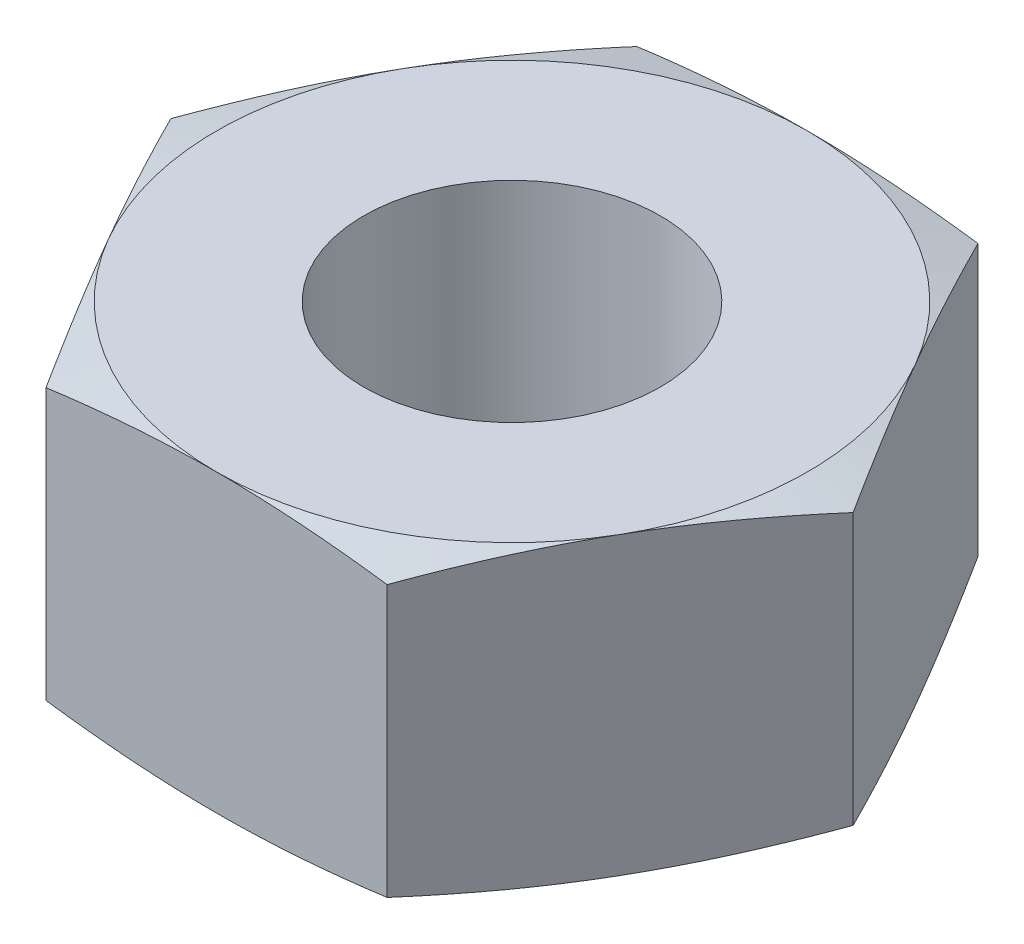
ISO-10303-21;
HEADER;
FILE_DESCRIPTION(('STEP AP214'),'2;1');
FILE_NAME('part.step','',(''),(''),'','','');
FILE_SCHEMA(('AUTOMOTIVE_DESIGN { 1 0 10303 214 1 1 1 1 }'));
ENDSEC;
DATA;
#1=APPLICATION_CONTEXT('core data for automotive mechanical design processes');
#2=APPLICATION_PROTOCOL_DEFINITION('international standard','automotive_design',2000,#1);
#3=PRODUCT_CONTEXT('',#1,'mechanical');
#4=PRODUCT('Part','Part','',(#3));
#5=PRODUCT_RELATED_PRODUCT_CATEGORY('part','',(#4));
#6=PRODUCT_DEFINITION_FORMATION('','',#4);
#7=PRODUCT_DEFINITION_CONTEXT('part definition',#1,'design');
#8=PRODUCT_DEFINITION('design','',#6,#7);
#9=PRODUCT_DEFINITION_SHAPE('','',#8);
#10=(LENGTH_UNIT() NAMED_UNIT(*) SI_UNIT(.MILLI.,.METRE.));
#11=(NAMED_UNIT(*) PLANE_ANGLE_UNIT() SI_UNIT($,.RADIAN.));
#12=(NAMED_UNIT(*) SI_UNIT($,.STERADIAN.) SOLID_ANGLE_UNIT());
#13=UNCERTAINTY_MEASURE_WITH_UNIT(LENGTH_MEASURE(1.E-05),#10,'distance_accuracy_value','');
#14=(GEOMETRIC_REPRESENTATION_CONTEXT(3) GLOBAL_UNCERTAINTY_ASSIGNED_CONTEXT((#13)) GLOBAL_UNIT_ASSIGNED_CONTEXT((#10,
#11,#12)) REPRESENTATION_CONTEXT('',''));
#15=CARTESIAN_POINT('',(0.,0.,0.));
#16=DIRECTION('',(0.,0.,1.));
#17=DIRECTION('',(1.,0.,0.));
#18=AXIS2_PLACEMENT_3D('',#15,#16,#17);
#19=CARTESIAN_POINT('',(2.3094010767585,2.,4.));
#20=DIRECTION('',(-0.866025403784439,0.,-0.5));
#21=DIRECTION('',(-0.5,0.,0.866025403784439));
#22=AXIS2_PLACEMENT_3D('',#19,#20,#21);
#23=PLANE('',#22);
#24=CARTESIAN_POINT('',(4.61891762357084,-1.83416152142258,-0.00020000000000131));
#25=CARTESIAN_POINT('',(4.52300443742428,-1.85987303025889,0.165926511521661));
#26=CARTESIAN_POINT('',(4.42691734174285,-1.88321489853113,0.332354243193626));
#27=CARTESIAN_POINT('',(4.23440378825448,-1.9242244457158,0.665797498981119));
#28=CARTESIAN_POINT('',(4.13797720861907,-1.94188981954163,0.832813234109736));
#29=CARTESIAN_POINT('',(3.94536936350192,-1.97051501923541,1.16641980778899));
#30=CARTESIAN_POINT('',(3.84918940062809,-1.98150898419453,1.33300839015655));
#31=CARTESIAN_POINT('',(3.65670681198446,-1.99625077349232,1.66639801325971));
#32=CARTESIAN_POINT('',(3.5604042135611,-1.99999999999999,1.83319900662985));
#33=CARTESIAN_POINT('',(3.3677990167144,-1.99999999999999,2.16680099337015));
#34=CARTESIAN_POINT('',(3.27149641829105,-1.99625077349232,2.33360198674029));
#35=CARTESIAN_POINT('',(3.07901382964742,-1.98150898419453,2.66699160984345));
#36=CARTESIAN_POINT('',(2.98283386677359,-1.97051501923541,2.83358019221101));
#37=CARTESIAN_POINT('',(2.79022602165644,-1.94188981954163,3.16718676589026));
#38=CARTESIAN_POINT('',(2.69379944202103,-1.9242244457158,3.33420250101888));
#39=CARTESIAN_POINT('',(2.50128588853266,-1.88321489853113,3.66764575680637));
#40=CARTESIAN_POINT('',(2.40519879285123,-1.85987303025888,3.83407348847834));
#41=CARTESIAN_POINT('',(2.30928560670466,-1.83416152142257,4.0002));
#42=B_SPLINE_CURVE_WITH_KNOTS('',3,(#24,#25,#26,#27,#28,#29,#30,#31,#32,#33,#34,#35,#36,#37,#38,
#39,#40,#41),.UNSPECIFIED.,.F.,.F.,(4,2,2,2,2,2,2,2,4),(0.,0.580655908162846,1.1615473094924,
1.73944052622642,2.31722188451988,2.89500324281333,3.47289645954735,4.05378786087691,
4.63444376903975),.UNSPECIFIED.);
#43=CARTESIAN_POINT('',(4.61880215351701,-1.83419246269047,0.));
#44=VERTEX_POINT('',#43);
#45=CARTESIAN_POINT('',(3.46410161513776,-2.,2.));
#46=VERTEX_POINT('',#45);
#47=EDGE_CURVE('E54',#44,#46,#42,.T.);
#48=ORIENTED_EDGE('',*,*,#47,.F.);
#49=DIRECTION('',(0.,-1.,0.));
#50=VECTOR('',#49,1.);
#51=CARTESIAN_POINT('',(4.61880215351701,2.,0.));
#52=LINE('',#51,#50);
#53=CARTESIAN_POINT('',(4.618802153517,1.83419246269047,0.));
#54=VERTEX_POINT('',#53);
#55=EDGE_CURVE('E171',#54,#44,#52,.T.);
#56=ORIENTED_EDGE('',*,*,#55,.F.);
#57=CARTESIAN_POINT('',(2.30928560670466,1.83416152142257,4.0002));
#58=CARTESIAN_POINT('',(2.40519879285123,1.85987303025889,3.83407348847834));
#59=CARTESIAN_POINT('',(2.50128588853266,1.88321489853113,3.66764575680637));
#60=CARTESIAN_POINT('',(2.69379944202103,1.9242244457158,3.33420250101888));
#61=CARTESIAN_POINT('',(2.79022602165644,1.94188981954163,3.16718676589026));
#62=CARTESIAN_POINT('',(2.98283386677359,1.97051501923541,2.83358019221101));
#63=CARTESIAN_POINT('',(3.07901382964742,1.98150898419453,2.66699160984345));
#64=CARTESIAN_POINT('',(3.27149641829105,1.99625077349232,2.33360198674029));
#65=CARTESIAN_POINT('',(3.3677990167144,1.99999999999999,2.16680099337015));
#66=CARTESIAN_POINT('',(3.5604042135611,1.99999999999999,1.83319900662985));
#67=CARTESIAN_POINT('',(3.65670681198446,1.99625077349232,1.66639801325971));
#68=CARTESIAN_POINT('',(3.84918940062809,1.98150898419453,1.33300839015655));
#69=CARTESIAN_POINT('',(3.94536936350192,1.97051501923541,1.16641980778899));
#70=CARTESIAN_POINT('',(4.13797720861907,1.94188981954163,0.832813234109736));
#71=CARTESIAN_POINT('',(4.23440378825448,1.9242244457158,0.665797498981119));
#72=CARTESIAN_POINT('',(4.42691734174285,1.88321489853113,0.332354243193626));
#73=CARTESIAN_POINT('',(4.52300443742428,1.85987303025889,0.165926511521661));
#74=CARTESIAN_POINT('',(4.61891762357084,1.83416152142257,-0.000200000000001436));
#75=B_SPLINE_CURVE_WITH_KNOTS('',3,(#57,#58,#59,#60,#61,#62,#63,#64,#65,#66,#67,#68,#69,#70,#71,
#72,#73,#74),.UNSPECIFIED.,.F.,.F.,(4,2,2,2,2,2,2,2,4),(0.,0.580655908162845,1.1615473094924,
1.73944052622642,2.31722188451988,2.89500324281333,3.47289645954735,4.05378786087691,
4.63444376903975),.UNSPECIFIED.);
#76=CARTESIAN_POINT('',(3.46410161513776,2.,2.));
#77=VERTEX_POINT('',#76);
#78=EDGE_CURVE('E260',#77,#54,#75,.T.);
#79=ORIENTED_EDGE('',*,*,#78,.F.);
#80=CARTESIAN_POINT('',(2.3094010767585,1.83419246269048,4.));
#81=VERTEX_POINT('',#80);
#82=EDGE_CURVE('E162',#81,#77,#75,.T.);
#83=ORIENTED_EDGE('',*,*,#82,.F.);
#84=DIRECTION('',(0.,-1.,0.));
#85=VECTOR('',#84,1.);
#86=CARTESIAN_POINT('',(2.3094010767585,2.,4.));
#87=LINE('',#86,#85);
#88=CARTESIAN_POINT('',(2.30940107675851,-1.83419246269048,4.));
#89=VERTEX_POINT('',#88);
#90=EDGE_CURVE('E157',#81,#89,#87,.T.);
#91=ORIENTED_EDGE('',*,*,#90,.T.);
#92=EDGE_CURVE('E149',#46,#89,#42,.T.);
#93=ORIENTED_EDGE('',*,*,#92,.F.);
#94=EDGE_LOOP('',(#48,#56,#79,#83,#91,#93));
#95=FACE_BOUND('',#94,.T.);
#96=ADVANCED_FACE('F38',(#95),#23,.F.);
#97=CARTESIAN_POINT('',(4.61880215351701,2.,0.));
#98=DIRECTION('',(-0.866025403784439,0.,0.5));
#99=DIRECTION('',(0.5,0.,0.866025403784439));
#100=AXIS2_PLACEMENT_3D('',#97,#98,#99);
#101=PLANE('',#100);
#102=CARTESIAN_POINT('',(2.30928560670467,-1.83416152142257,-4.0002));
#103=CARTESIAN_POINT('',(2.40519879285123,-1.85987303025889,-3.83407348847834));
#104=CARTESIAN_POINT('',(2.50128588853266,-1.88321489853113,-3.66764575680637));
#105=CARTESIAN_POINT('',(2.69379944202103,-1.9242244457158,-3.33420250101888));
#106=CARTESIAN_POINT('',(2.79022602165644,-1.94188981954163,-3.16718676589026));
#107=CARTESIAN_POINT('',(2.98283386677359,-1.97051501923541,-2.83358019221101));
#108=CARTESIAN_POINT('',(3.07901382964742,-1.98150898419453,-2.66699160984345));
#109=CARTESIAN_POINT('',(3.27149641829105,-1.99625077349232,-2.33360198674029));
#110=CARTESIAN_POINT('',(3.3677990167144,-1.99999999999999,-2.16680099337015));
#111=CARTESIAN_POINT('',(3.56040421356111,-1.99999999999999,-1.83319900662985));
#112=CARTESIAN_POINT('',(3.65670681198446,-1.99625077349232,-1.66639801325971));
#113=CARTESIAN_POINT('',(3.84918940062809,-1.98150898419454,-1.33300839015655));
#114=CARTESIAN_POINT('',(3.94536936350192,-1.97051501923541,-1.16641980778899));
#115=CARTESIAN_POINT('',(4.13797720861907,-1.94188981954163,-0.832813234109737));
#116=CARTESIAN_POINT('',(4.23440378825448,-1.9242244457158,-0.66579749898112));
#117=CARTESIAN_POINT('',(4.42691734174285,-1.88321489853113,-0.332354243193627));
#118=CARTESIAN_POINT('',(4.52300443742428,-1.85987303025888,-0.165926511521662));
#119=CARTESIAN_POINT('',(4.61891762357084,-1.83416152142257,0.000199999999999917));
#120=B_SPLINE_CURVE_WITH_KNOTS('',3,(#102,#103,#104,#105,#106,#107,#108,#109,#110,#111,#112,
#113,#114,#115,#116,#117,#118,#119),.UNSPECIFIED.,.F.,.F.,(4,2,2,2,2,2,2,2,4),(0.,
0.580655908162846,1.1615473094924,1.73944052622642,2.31722188451988,2.89500324281333,
3.47289645954735,4.05378786087691,4.63444376903975),.UNSPECIFIED.);
#121=CARTESIAN_POINT('',(2.3094010767585,-1.83419246269047,-4.00000000000001));
#122=VERTEX_POINT('',#121);
#123=CARTESIAN_POINT('',(3.46410161513776,-2.,-2.));
#124=VERTEX_POINT('',#123);
#125=EDGE_CURVE('E61',#122,#124,#120,.T.);
#126=ORIENTED_EDGE('',*,*,#125,.F.);
#127=DIRECTION('',(0.,-1.,0.));
#128=VECTOR('',#127,1.);
#129=CARTESIAN_POINT('',(2.3094010767585,2.,-4.));
#130=LINE('',#129,#128);
#131=CARTESIAN_POINT('',(2.3094010767585,1.83419246269048,-4.));
#132=VERTEX_POINT('',#131);
#133=EDGE_CURVE('E168',#132,#122,#130,.T.);
#134=ORIENTED_EDGE('',*,*,#133,.F.);
#135=CARTESIAN_POINT('',(4.61891762357084,1.83416152142258,0.000199999999998567));
#136=CARTESIAN_POINT('',(4.52300443742428,1.85987303025888,-0.165926511521664));
#137=CARTESIAN_POINT('',(4.42691734174285,1.88321489853113,-0.332354243193629));
#138=CARTESIAN_POINT('',(4.23440378825448,1.9242244457158,-0.665797498981122));
#139=CARTESIAN_POINT('',(4.13797720861907,1.94188981954163,-0.832813234109739));
#140=CARTESIAN_POINT('',(3.94536936350192,1.97051501923541,-1.16641980778899));
#141=CARTESIAN_POINT('',(3.84918940062809,1.98150898419453,-1.33300839015655));
#142=CARTESIAN_POINT('',(3.65670681198446,1.99625077349232,-1.66639801325971));
#143=CARTESIAN_POINT('',(3.5604042135611,1.99999999999999,-1.83319900662986));
#144=CARTESIAN_POINT('',(3.3677990167144,1.99999999999999,-2.16680099337015));
#145=CARTESIAN_POINT('',(3.27149641829105,1.99625077349232,-2.3336019867403));
#146=CARTESIAN_POINT('',(3.07901382964742,1.98150898419453,-2.66699160984345));
#147=CARTESIAN_POINT('',(2.98283386677359,1.97051501923541,-2.83358019221101));
#148=CARTESIAN_POINT('',(2.79022602165644,1.94188981954163,-3.16718676589027));
#149=CARTESIAN_POINT('',(2.69379944202103,1.9242244457158,-3.33420250101888));
#150=CARTESIAN_POINT('',(2.50128588853266,1.88321489853113,-3.66764575680638));
#151=CARTESIAN_POINT('',(2.40519879285123,1.85987303025888,-3.83407348847834));
#152=CARTESIAN_POINT('',(2.30928560670466,1.83416152142257,-4.0002));
#153=B_SPLINE_CURVE_WITH_KNOTS('',3,(#135,#136,#137,#138,#139,#140,#141,#142,#143,#144,#145,
#146,#147,#148,#149,#150,#151,#152),.UNSPECIFIED.,.F.,.F.,(4,2,2,2,2,2,2,2,4),(0.,
0.580655908162846,1.1615473094924,1.73944052622642,2.31722188451988,2.89500324281333,
3.47289645954735,4.05378786087691,4.63444376903975),.UNSPECIFIED.);
#154=CARTESIAN_POINT('',(3.46410161513776,2.,-2.));
#155=VERTEX_POINT('',#154);
#156=EDGE_CURVE('E254',#155,#132,#153,.T.);
#157=ORIENTED_EDGE('',*,*,#156,.F.);
#158=EDGE_CURVE('E258',#54,#155,#153,.T.);
#159=ORIENTED_EDGE('',*,*,#158,.F.);
#160=ORIENTED_EDGE('',*,*,#55,.T.);
#161=EDGE_CURVE('E272',#124,#44,#120,.T.);
#162=ORIENTED_EDGE('',*,*,#161,.F.);
#163=EDGE_LOOP('',(#126,#134,#157,#159,#160,#162));
#164=FACE_BOUND('',#163,.T.);
#165=ADVANCED_FACE('F264',(#164),#101,.F.);
#166=CARTESIAN_POINT('',(2.3094010767585,2.,-4.));
#167=DIRECTION('',(0.,0.,1.));
#168=DIRECTION('',(1.,0.,0.));
#169=AXIS2_PLACEMENT_3D('',#166,#167,#168);
#170=PLANE('',#169);
#171=CARTESIAN_POINT('',(-6.16599236504026,-1.10242558511274,-4.));
#172=CARTESIAN_POINT('',(-5.98374837855965,-1.14338166597304,-4.));
#173=CARTESIAN_POINT('',(-5.80139189524659,-1.18384598299308,-4.));
#174=CARTESIAN_POINT('',(-5.43639850190789,-1.26352530844095,-4.));
#175=CARTESIAN_POINT('',(-5.25376158044574,-1.30274026441975,-4.));
#176=CARTESIAN_POINT('',(-4.88800230341772,-1.37968628737431,-4.));
#177=CARTESIAN_POINT('',(-4.70487965861463,-1.4174159842779,-4.));
#178=CARTESIAN_POINT('',(-4.33825698989427,-1.49099402038948,-4.));
#179=CARTESIAN_POINT('',(-4.15475696908091,-1.52684237500772,-4.));
#180=CARTESIAN_POINT('',(-3.78900584670662,-1.59588851988633,-4.));
#181=CARTESIAN_POINT('',(-3.60675879715868,-1.6291076710752,-4.));
#182=CARTESIAN_POINT('',(-3.24177099006516,-1.69270784370168,-4.));
#183=CARTESIAN_POINT('',(-3.0590302432084,-1.72308892608635,-4.));
#184=CARTESIAN_POINT('',(-2.69300898522772,-1.78034212500984,-4.));
#185=CARTESIAN_POINT('',(-2.50972851492077,-1.80721450026504,-4.));
#186=CARTESIAN_POINT('',(-2.14258046798198,-1.85666917119193,-4.));
#187=CARTESIAN_POINT('',(-1.95871288245767,-1.87925140156857,-4.));
#188=CARTESIAN_POINT('',(-1.58826869034281,-1.91950231192418,-4.));
#189=CARTESIAN_POINT('',(-1.40168544576405,-1.93711079788093,-4.));
#190=CARTESIAN_POINT('',(-1.02804967912333,-1.96620294006114,-4.));
#191=CARTESIAN_POINT('',(-0.840997198665243,-1.97768712125394,-4.));
#192=CARTESIAN_POINT('',(-0.466688396958207,-1.99386389489615,-4.));
#193=CARTESIAN_POINT('',(-0.279432228439619,-1.99855995011656,-4.));
#194=CARTESIAN_POINT('',(0.0951244758784506,-2.00087124664522,-4.));
#195=CARTESIAN_POINT('',(0.282425011621254,-1.9984864969508,-4.));
#196=CARTESIAN_POINT('',(0.657696829795662,-1.98676293986905,-4.));
#197=CARTESIAN_POINT('',(0.845667058136624,-1.97739106611449,-4.));
#198=CARTESIAN_POINT('',(1.2211788381433,-1.95222450743333,-4.));
#199=CARTESIAN_POINT('',(1.40872036641709,-1.93642948006218,-4.));
#200=CARTESIAN_POINT('',(1.78337574758013,-1.89922887180382,-4.));
#201=CARTESIAN_POINT('',(1.97048918823084,-1.87781920287599,-4.));
#202=CARTESIAN_POINT('',(2.34410894336789,-1.83029810314332,-4.));
#203=CARTESIAN_POINT('',(2.53061526160606,-1.80418670145009,-4.));
#204=CARTESIAN_POINT('',(2.95292773923526,-1.74061022199472,-4.));
#205=CARTESIAN_POINT('',(3.18855688220605,-1.7019774583977,-4.));
#206=CARTESIAN_POINT('',(3.65899967094087,-1.62000763803013,-4.));
#207=CARTESIAN_POINT('',(3.8938132649902,-1.57667028836165,-4.));
#208=CARTESIAN_POINT('',(4.36280564062942,-1.48641921641095,-4.));
#209=CARTESIAN_POINT('',(4.59698425770332,-1.43950464478847,-4.));
#210=CARTESIAN_POINT('',(5.06477235075272,-1.34295980695753,-4.));
#211=CARTESIAN_POINT('',(5.29838183967219,-1.29332960312585,-4.));
#212=CARTESIAN_POINT('',(5.76529990616543,-1.19194728507016,-4.));
#213=CARTESIAN_POINT('',(5.99860818310673,-1.1401937910908,-4.));
#214=CARTESIAN_POINT('',(6.46485742696684,-1.03505524668769,-4.));
#215=CARTESIAN_POINT('',(6.69779839139018,-0.981670185229109,-4.));
#216=CARTESIAN_POINT('',(7.39611037846748,-0.819622275392078,-4.));
#217=CARTESIAN_POINT('',(7.86103821349195,-0.709051765079212,-4.));
#218=CARTESIAN_POINT('',(8.78231498206804,-0.486533761876013,-4.));
#219=CARTESIAN_POINT('',(9.2386770833652,-0.374640418923415,-4.));
#220=CARTESIAN_POINT('',(10.1508849863026,-0.148690115749639,-4.));
#221=CARTESIAN_POINT('',(10.6067307654923,-0.0346330650051822,-4.));
#222=CARTESIAN_POINT('',(11.5171280485483,0.194769248555569,-4.));
#223=CARTESIAN_POINT('',(11.9716803179539,0.3101114799453,-4.));
#224=CARTESIAN_POINT('',(12.8804723188615,0.541921869935255,-4.));
#225=CARTESIAN_POINT('',(13.334712065574,0.658389968869935,-4.));
#226=CARTESIAN_POINT('',(13.7888541111415,0.775234224429538,-4.));
#227=B_SPLINE_CURVE_WITH_KNOTS('',3,(#171,#172,#173,#174,#175,#176,#177,#178,#179,#180,#181,
#182,#183,#184,#185,#186,#187,#188,#189,#190,#191,#192,#193,#194,#195,#196,#197,#198,#199,#200,
#201,#202,#203,#204,#205,#206,#207,#208,#209,#210,#211,#212,#213,#214,#215,#216,#217,#218,#219,
#220,#221,#222,#223,#224,#225,#226),.UNSPECIFIED.,.F.,.F.,(4,2,2,2,2,2,2,2,2,2,2,2,2,2,2,2,2,2,
2,2,2,2,2,2,2,2,2,4),(0.,0.560370344887482,1.12076418359083,1.68166338897646,2.24255799926784,
2.79828957826021,3.35400922026339,3.90968786281572,4.46537496199854,5.0275241942152,
5.58962523180797,6.15143942809603,6.71325291050577,7.27774217203266,7.84226153273475,
8.4071930687213,8.97212110695492,9.68838007570401,10.4046836628782,11.12115785488,
11.8376155967139,12.5545465188979,13.2714822910001,14.7051458097955,16.1147775410928,
17.5244683779399,18.9313408237204,20.3381391163944),.UNSPECIFIED.);
#228=CARTESIAN_POINT('',(-2.3094010767585,-1.83419246269047,-4.00000000000001));
#229=VERTEX_POINT('',#228);
#230=CARTESIAN_POINT('',(0.,-2.,-4.));
#231=VERTEX_POINT('',#230);
#232=EDGE_CURVE('E287',#229,#231,#227,.T.);
#233=ORIENTED_EDGE('',*,*,#232,.F.);
#234=DIRECTION('',(0.,-1.,0.));
#235=VECTOR('',#234,1.);
#236=CARTESIAN_POINT('',(-2.3094010767585,2.,-4.));
#237=LINE('',#236,#235);
#238=CARTESIAN_POINT('',(-2.3094010767585,1.83419246269047,-4.));
#239=VERTEX_POINT('',#238);
#240=EDGE_CURVE('E159',#239,#229,#237,.T.);
#241=ORIENTED_EDGE('',*,*,#240,.F.);
#242=CARTESIAN_POINT('',(-6.16599236504026,1.10242558511274,-4.));
#243=CARTESIAN_POINT('',(-5.98374837855964,1.14338166597304,-4.));
#244=CARTESIAN_POINT('',(-5.80139189524659,1.18384598299307,-4.));
#245=CARTESIAN_POINT('',(-5.43639850190788,1.26352530844095,-4.));
#246=CARTESIAN_POINT('',(-5.25376158044574,1.30274026441975,-4.));
#247=CARTESIAN_POINT('',(-4.88800230341772,1.37968628737431,-4.));
#248=CARTESIAN_POINT('',(-4.70487965861463,1.4174159842779,-4.));
#249=CARTESIAN_POINT('',(-4.33825698989427,1.49099402038948,-4.));
#250=CARTESIAN_POINT('',(-4.15475696908091,1.52684237500772,-4.));
#251=CARTESIAN_POINT('',(-3.78900584670662,1.59588851988634,-4.));
#252=CARTESIAN_POINT('',(-3.60675879715868,1.6291076710752,-4.));
#253=CARTESIAN_POINT('',(-3.24177099006516,1.69270784370168,-4.));
#254=CARTESIAN_POINT('',(-3.0590302432084,1.72308892608635,-4.));
#255=CARTESIAN_POINT('',(-2.69300898522772,1.78034212500984,-4.));
#256=CARTESIAN_POINT('',(-2.50972851492077,1.80721450026504,-4.));
#257=CARTESIAN_POINT('',(-2.14258046798198,1.85666917119193,-4.));
#258=CARTESIAN_POINT('',(-1.95871288245766,1.87925140156856,-4.));
#259=CARTESIAN_POINT('',(-1.58826869034281,1.91950231192418,-4.));
#260=CARTESIAN_POINT('',(-1.40168544576405,1.93711079788093,-4.));
#261=CARTESIAN_POINT('',(-1.02804967912332,1.96620294006114,-4.));
#262=CARTESIAN_POINT('',(-0.840997198665241,1.97768712125394,-4.));
#263=CARTESIAN_POINT('',(-0.466688396958206,1.99386389489615,-4.));
#264=CARTESIAN_POINT('',(-0.279432228439618,1.99855995011656,-4.));
#265=CARTESIAN_POINT('',(0.0951244758784518,2.00087124664522,-4.));
#266=CARTESIAN_POINT('',(0.282425011621255,1.9984864969508,-4.));
#267=CARTESIAN_POINT('',(0.657696829795664,1.98676293986905,-4.));
#268=CARTESIAN_POINT('',(0.845667058136625,1.97739106611449,-4.));
#269=CARTESIAN_POINT('',(1.2211788381433,1.95222450743333,-4.));
#270=CARTESIAN_POINT('',(1.4087203664171,1.93642948006218,-4.));
#271=CARTESIAN_POINT('',(1.78337574758013,1.89922887180382,-4.));
#272=CARTESIAN_POINT('',(1.97048918823084,1.87781920287599,-4.));
#273=CARTESIAN_POINT('',(2.34410894336789,1.83029810314332,-4.));
#274=CARTESIAN_POINT('',(2.53061526160606,1.80418670145009,-4.));
#275=CARTESIAN_POINT('',(2.95292773923526,1.74061022199472,-4.));
#276=CARTESIAN_POINT('',(3.18855688220605,1.7019774583977,-4.));
#277=CARTESIAN_POINT('',(3.65899967094087,1.62000763803013,-4.));
#278=CARTESIAN_POINT('',(3.8938132649902,1.57667028836164,-4.));
#279=CARTESIAN_POINT('',(4.36280564062943,1.48641921641094,-4.));
#280=CARTESIAN_POINT('',(4.59698425770332,1.43950464478847,-4.));
#281=CARTESIAN_POINT('',(5.06477235075272,1.34295980695753,-4.));
#282=CARTESIAN_POINT('',(5.29838183967219,1.29332960312585,-4.));
#283=CARTESIAN_POINT('',(5.76529990616543,1.19194728507016,-4.));
#284=CARTESIAN_POINT('',(5.99860818310673,1.1401937910908,-4.));
#285=CARTESIAN_POINT('',(6.46485742696684,1.03505524668769,-4.));
#286=CARTESIAN_POINT('',(6.69779839139019,0.981670185229109,-4.));
#287=CARTESIAN_POINT('',(7.39611037846748,0.81962227539208,-4.));
#288=CARTESIAN_POINT('',(7.86103821349195,0.709051765079213,-4.));
#289=CARTESIAN_POINT('',(8.78231498206804,0.486533761876013,-4.));
#290=CARTESIAN_POINT('',(9.23867708336521,0.374640418923415,-4.));
#291=CARTESIAN_POINT('',(10.1508849863026,0.148690115749639,-4.));
#292=CARTESIAN_POINT('',(10.6067307654923,0.0346330650051831,-4.));
#293=CARTESIAN_POINT('',(11.5171280485483,-0.194769248555568,-4.));
#294=CARTESIAN_POINT('',(11.9716803179539,-0.310111479945299,-4.));
#295=CARTESIAN_POINT('',(12.8804723188615,-0.541921869935256,-4.));
#296=CARTESIAN_POINT('',(13.334712065574,-0.658389968869938,-4.));
#297=CARTESIAN_POINT('',(13.7888541111415,-0.775234224429542,-4.));
#298=B_SPLINE_CURVE_WITH_KNOTS('',3,(#242,#243,#244,#245,#246,#247,#248,#249,#250,#251,#252,
#253,#254,#255,#256,#257,#258,#259,#260,#261,#262,#263,#264,#265,#266,#267,#268,#269,#270,#271,
#272,#273,#274,#275,#276,#277,#278,#279,#280,#281,#282,#283,#284,#285,#286,#287,#288,#289,#290,
#291,#292,#293,#294,#295,#296,#297),.UNSPECIFIED.,.F.,.F.,(4,2,2,2,2,2,2,2,2,2,2,2,2,2,2,2,2,2,
2,2,2,2,2,2,2,2,2,4),(0.,0.560370344887483,1.12076418359083,1.68166338897646,2.24255799926784,
2.79828957826021,3.35400922026339,3.90968786281572,4.46537496199854,5.0275241942152,
5.58962523180797,6.15143942809603,6.71325291050577,7.27774217203266,7.84226153273475,
8.4071930687213,8.97212110695492,9.68838007570401,10.4046836628782,11.12115785488,
11.8376155967139,12.5545465188979,13.2714822910001,14.7051458097955,16.1147775410928,
17.5244683779399,18.9313408237204,20.3381391163944),.UNSPECIFIED.);
#299=CARTESIAN_POINT('',(0.,2.,-4.));
#300=VERTEX_POINT('',#299);
#301=EDGE_CURVE('E211',#300,#239,#298,.F.);
#302=ORIENTED_EDGE('',*,*,#301,.F.);
#303=EDGE_CURVE('E259',#132,#300,#298,.F.);
#304=ORIENTED_EDGE('',*,*,#303,.F.);
#305=ORIENTED_EDGE('',*,*,#133,.T.);
#306=EDGE_CURVE('E283',#231,#122,#227,.T.);
#307=ORIENTED_EDGE('',*,*,#306,.F.);
#308=EDGE_LOOP('',(#233,#241,#302,#304,#305,#307));
#309=FACE_BOUND('',#308,.T.);
#310=ADVANCED_FACE('F267',(#309),#170,.F.);
#311=CARTESIAN_POINT('',(-2.3094010767585,2.,-4.));
#312=DIRECTION('',(0.866025403784439,0.,0.5));
#313=DIRECTION('',(0.5,0.,-0.866025403784439));
#314=AXIS2_PLACEMENT_3D('',#311,#312,#313);
#315=PLANE('',#314);
#316=CARTESIAN_POINT('',(-4.61891762357085,-1.83416152142257,0.000199999999998324));
#317=CARTESIAN_POINT('',(-4.52300443742428,-1.85987303025888,-0.165926511521664));
#318=CARTESIAN_POINT('',(-4.42691734174285,-1.88321489853113,-0.332354243193629));
#319=CARTESIAN_POINT('',(-4.23440378825448,-1.9242244457158,-0.665797498981122));
#320=CARTESIAN_POINT('',(-4.13797720861907,-1.94188981954163,-0.832813234109739));
#321=CARTESIAN_POINT('',(-3.94536936350192,-1.97051501923541,-1.16641980778899));
#322=CARTESIAN_POINT('',(-3.84918940062809,-1.98150898419453,-1.33300839015655));
#323=CARTESIAN_POINT('',(-3.65670681198446,-1.99625077349232,-1.66639801325971));
#324=CARTESIAN_POINT('',(-3.56040421356111,-1.99999999999999,-1.83319900662986));
#325=CARTESIAN_POINT('',(-3.3677990167144,-1.99999999999999,-2.16680099337015));
#326=CARTESIAN_POINT('',(-3.27149641829105,-1.99625077349232,-2.3336019867403));
#327=CARTESIAN_POINT('',(-3.07901382964742,-1.98150898419453,-2.66699160984345));
#328=CARTESIAN_POINT('',(-2.98283386677359,-1.97051501923541,-2.83358019221101));
#329=CARTESIAN_POINT('',(-2.79022602165644,-1.94188981954163,-3.16718676589027));
#330=CARTESIAN_POINT('',(-2.69379944202103,-1.9242244457158,-3.33420250101888));
#331=CARTESIAN_POINT('',(-2.50128588853266,-1.88321489853113,-3.66764575680638));
#332=CARTESIAN_POINT('',(-2.40519879285123,-1.85987303025888,-3.83407348847834));
#333=CARTESIAN_POINT('',(-2.30928560670467,-1.83416152142257,-4.0002));
#334=B_SPLINE_CURVE_WITH_KNOTS('',3,(#316,#317,#318,#319,#320,#321,#322,#323,#324,#325,#326,
#327,#328,#329,#330,#331,#332,#333),.UNSPECIFIED.,.F.,.F.,(4,2,2,2,2,2,2,2,4),(0.,
0.580655908162846,1.1615473094924,1.73944052622642,2.31722188451988,2.89500324281333,
3.47289645954735,4.05378786087691,4.63444376903975),.UNSPECIFIED.);
#335=CARTESIAN_POINT('',(-4.61880215351701,-1.83419246269047,0.));
#336=VERTEX_POINT('',#335);
#337=CARTESIAN_POINT('',(-3.46410161513776,-2.,-2.));
#338=VERTEX_POINT('',#337);
#339=EDGE_CURVE('E278',#336,#338,#334,.T.);
#340=ORIENTED_EDGE('',*,*,#339,.F.);
#341=DIRECTION('',(0.,-1.,0.));
#342=VECTOR('',#341,1.);
#343=CARTESIAN_POINT('',(-4.61880215351701,2.,0.));
#344=LINE('',#343,#342);
#345=CARTESIAN_POINT('',(-4.61880215351701,1.83419246269047,0.));
#346=VERTEX_POINT('',#345);
#347=EDGE_CURVE('E156',#346,#336,#344,.T.);
#348=ORIENTED_EDGE('',*,*,#347,.F.);
#349=CARTESIAN_POINT('',(-2.30928560670467,1.83416152142257,-4.0002));
#350=CARTESIAN_POINT('',(-2.40519879285123,1.85987303025888,-3.83407348847834));
#351=CARTESIAN_POINT('',(-2.50128588853266,1.88321489853113,-3.66764575680638));
#352=CARTESIAN_POINT('',(-2.69379944202103,1.9242244457158,-3.33420250101888));
#353=CARTESIAN_POINT('',(-2.79022602165644,1.94188981954163,-3.16718676589027));
#354=CARTESIAN_POINT('',(-2.98283386677359,1.97051501923541,-2.83358019221101));
#355=CARTESIAN_POINT('',(-3.07901382964742,1.98150898419453,-2.66699160984345));
#356=CARTESIAN_POINT('',(-3.27149641829105,1.99625077349232,-2.33360198674029));
#357=CARTESIAN_POINT('',(-3.3677990167144,1.99999999999999,-2.16680099337015));
#358=CARTESIAN_POINT('',(-3.56040421356111,1.99999999999999,-1.83319900662985));
#359=CARTESIAN_POINT('',(-3.65670681198446,1.99625077349232,-1.66639801325971));
#360=CARTESIAN_POINT('',(-3.84918940062809,1.98150898419453,-1.33300839015655));
#361=CARTESIAN_POINT('',(-3.94536936350192,1.97051501923541,-1.16641980778899));
#362=CARTESIAN_POINT('',(-4.13797720861907,1.94188981954163,-0.832813234109737));
#363=CARTESIAN_POINT('',(-4.23440378825448,1.9242244457158,-0.665797498981121));
#364=CARTESIAN_POINT('',(-4.42691734174285,1.88321489853113,-0.332354243193628));
#365=CARTESIAN_POINT('',(-4.52300443742428,1.85987303025888,-0.165926511521663));
#366=CARTESIAN_POINT('',(-4.61891762357085,1.83416152142257,0.000199999999999883));
#367=B_SPLINE_CURVE_WITH_KNOTS('',3,(#349,#350,#351,#352,#353,#354,#355,#356,#357,#358,#359,
#360,#361,#362,#363,#364,#365,#366),.UNSPECIFIED.,.F.,.F.,(4,2,2,2,2,2,2,2,4),(0.,
0.580655908162846,1.1615473094924,1.73944052622642,2.31722188451988,2.89500324281333,
3.47289645954735,4.05378786087691,4.63444376903975),.UNSPECIFIED.);
#368=CARTESIAN_POINT('',(-3.46410161513776,2.,-2.));
#369=VERTEX_POINT('',#368);
#370=EDGE_CURVE('E202',#369,#346,#367,.T.);
#371=ORIENTED_EDGE('',*,*,#370,.F.);
#372=EDGE_CURVE('E205',#239,#369,#367,.T.);
#373=ORIENTED_EDGE('',*,*,#372,.F.);
#374=ORIENTED_EDGE('',*,*,#240,.T.);
#375=EDGE_CURVE('E288',#338,#229,#334,.T.);
#376=ORIENTED_EDGE('',*,*,#375,.F.);
#377=EDGE_LOOP('',(#340,#348,#371,#373,#374,#376));
#378=FACE_BOUND('',#377,.T.);
#379=ADVANCED_FACE('F204',(#378),#315,.F.);
#380=CARTESIAN_POINT('',(-4.61880215351701,2.,0.));
#381=DIRECTION('',(0.866025403784439,0.,-0.5));
#382=DIRECTION('',(-0.5,0.,-0.866025403784439));
#383=AXIS2_PLACEMENT_3D('',#380,#381,#382);
#384=PLANE('',#383);
#385=CARTESIAN_POINT('',(-2.30928560670467,-1.83416152142257,4.0002));
#386=CARTESIAN_POINT('',(-2.40519879285123,-1.85987303025888,3.83407348847834));
#387=CARTESIAN_POINT('',(-2.50128588853266,-1.88321489853113,3.66764575680637));
#388=CARTESIAN_POINT('',(-2.69379944202103,-1.9242244457158,3.33420250101888));
#389=CARTESIAN_POINT('',(-2.79022602165644,-1.94188981954163,3.16718676589026));
#390=CARTESIAN_POINT('',(-2.98283386677359,-1.97051501923541,2.83358019221101));
#391=CARTESIAN_POINT('',(-3.07901382964742,-1.98150898419453,2.66699160984345));
#392=CARTESIAN_POINT('',(-3.27149641829105,-1.99625077349232,2.33360198674029));
#393=CARTESIAN_POINT('',(-3.36779901671441,-1.99999999999999,2.16680099337014));
#394=CARTESIAN_POINT('',(-3.56040421356111,-1.99999999999999,1.83319900662985));
#395=CARTESIAN_POINT('',(-3.65670681198446,-1.99625077349232,1.6663980132597));
#396=CARTESIAN_POINT('',(-3.84918940062809,-1.98150898419453,1.33300839015655));
#397=CARTESIAN_POINT('',(-3.94536936350192,-1.97051501923541,1.16641980778899));
#398=CARTESIAN_POINT('',(-4.13797720861907,-1.94188981954163,0.832813234109735));
#399=CARTESIAN_POINT('',(-4.23440378825448,-1.9242244457158,0.665797498981118));
#400=CARTESIAN_POINT('',(-4.42691734174285,-1.88321489853113,0.332354243193625));
#401=CARTESIAN_POINT('',(-4.52300443742428,-1.85987303025888,0.16592651152166));
#402=CARTESIAN_POINT('',(-4.61891762357085,-1.83416152142257,-0.00020000000000202));
#403=B_SPLINE_CURVE_WITH_KNOTS('',3,(#385,#386,#387,#388,#389,#390,#391,#392,#393,#394,#395,
#396,#397,#398,#399,#400,#401,#402),.UNSPECIFIED.,.F.,.F.,(4,2,2,2,2,2,2,2,4),(0.,
0.580655908162846,1.1615473094924,1.73944052622642,2.31722188451988,2.89500324281333,
3.47289645954735,4.0537878608769,4.63444376903975),.UNSPECIFIED.);
#404=CARTESIAN_POINT('',(-2.30940107675851,-1.83419246269047,4.));
#405=VERTEX_POINT('',#404);
#406=CARTESIAN_POINT('',(-3.46410161513776,-2.,2.));
#407=VERTEX_POINT('',#406);
#408=EDGE_CURVE('E132',#405,#407,#403,.T.);
#409=ORIENTED_EDGE('',*,*,#408,.F.);
#410=DIRECTION('',(0.,-1.,0.));
#411=VECTOR('',#410,1.);
#412=CARTESIAN_POINT('',(-2.30940107675851,2.,4.));
#413=LINE('',#412,#411);
#414=CARTESIAN_POINT('',(-2.30940107675851,1.83419246269048,4.));
#415=VERTEX_POINT('',#414);
#416=EDGE_CURVE('E146',#415,#405,#413,.T.);
#417=ORIENTED_EDGE('',*,*,#416,.F.);
#418=CARTESIAN_POINT('',(-4.61891762357085,1.83416152142257,-0.000200000000001325));
#419=CARTESIAN_POINT('',(-4.52300443742428,1.85987303025889,0.165926511521661));
#420=CARTESIAN_POINT('',(-4.42691734174285,1.88321489853113,0.332354243193626));
#421=CARTESIAN_POINT('',(-4.23440378825448,1.9242244457158,0.665797498981119));
#422=CARTESIAN_POINT('',(-4.13797720861907,1.94188981954163,0.832813234109735));
#423=CARTESIAN_POINT('',(-3.94536936350192,1.97051501923541,1.16641980778899));
#424=CARTESIAN_POINT('',(-3.84918940062809,1.98150898419453,1.33300839015655));
#425=CARTESIAN_POINT('',(-3.65670681198446,1.99625077349232,1.66639801325971));
#426=CARTESIAN_POINT('',(-3.56040421356111,1.99999999999999,1.83319900662985));
#427=CARTESIAN_POINT('',(-3.36779901671441,1.99999999999999,2.16680099337014));
#428=CARTESIAN_POINT('',(-3.27149641829105,1.99625077349232,2.33360198674029));
#429=CARTESIAN_POINT('',(-3.07901382964742,1.98150898419453,2.66699160984345));
#430=CARTESIAN_POINT('',(-2.98283386677359,1.97051501923541,2.83358019221101));
#431=CARTESIAN_POINT('',(-2.79022602165645,1.94188981954163,3.16718676589026));
#432=CARTESIAN_POINT('',(-2.69379944202104,1.9242244457158,3.33420250101888));
#433=CARTESIAN_POINT('',(-2.50128588853266,1.88321489853113,3.66764575680637));
#434=CARTESIAN_POINT('',(-2.40519879285123,1.85987303025888,3.83407348847834));
#435=CARTESIAN_POINT('',(-2.30928560670467,1.83416152142257,4.0002));
#436=B_SPLINE_CURVE_WITH_KNOTS('',3,(#418,#419,#420,#421,#422,#423,#424,#425,#426,#427,#428,
#429,#430,#431,#432,#433,#434,#435),.UNSPECIFIED.,.F.,.F.,(4,2,2,2,2,2,2,2,4),(0.,
0.580655908162846,1.1615473094924,1.73944052622642,2.31722188451987,2.89500324281333,
3.47289645954735,4.0537878608769,4.63444376903975),.UNSPECIFIED.);
#437=CARTESIAN_POINT('',(-3.46410161513776,2.,2.));
#438=VERTEX_POINT('',#437);
#439=EDGE_CURVE('E212',#438,#415,#436,.T.);
#440=ORIENTED_EDGE('',*,*,#439,.F.);
#441=EDGE_CURVE('E209',#346,#438,#436,.T.);
#442=ORIENTED_EDGE('',*,*,#441,.F.);
#443=ORIENTED_EDGE('',*,*,#347,.T.);
#444=EDGE_CURVE('E148',#407,#336,#403,.T.);
#445=ORIENTED_EDGE('',*,*,#444,.F.);
#446=EDGE_LOOP('',(#409,#417,#440,#442,#443,#445));
#447=FACE_BOUND('',#446,.T.);
#448=ADVANCED_FACE('F144',(#447),#384,.F.);
#449=CARTESIAN_POINT('',(-2.30940107675851,2.,4.));
#450=DIRECTION('',(0.,0.,-1.));
#451=DIRECTION('',(-1.,0.,0.));
#452=AXIS2_PLACEMENT_3D('',#449,#450,#451);
#453=PLANE('',#452);
#454=CARTESIAN_POINT('',(-6.1659923648636,-1.10242558515246,4.));
#455=CARTESIAN_POINT('',(-5.98374837839014,-1.1433816660108,4.));
#456=CARTESIAN_POINT('',(-5.80139189508424,-1.18384598302889,4.));
#457=CARTESIAN_POINT('',(-5.43639850175985,-1.26352530847289,4.));
#458=CARTESIAN_POINT('',(-5.25376158030487,-1.30274026444978,4.));
#459=CARTESIAN_POINT('',(-4.88800230329122,-1.37968628740054,4.));
#460=CARTESIAN_POINT('',(-4.70487965849533,-1.41741598430225,4.));
#461=CARTESIAN_POINT('',(-4.33825698978938,-1.49099402041014,4.));
#462=CARTESIAN_POINT('',(-4.15475696898324,-1.52684237502656,4.));
#463=CARTESIAN_POINT('',(-3.78900584662319,-1.59588851990169,4.));
#464=CARTESIAN_POINT('',(-3.60675879708229,-1.62910767108889,4.));
#465=CARTESIAN_POINT('',(-3.24177099000288,-1.69270784371216,4.));
#466=CARTESIAN_POINT('',(-3.05903024315319,-1.7230889260953,4.));
#467=CARTESIAN_POINT('',(-2.69300898518667,-1.78034212501594,4.));
#468=CARTESIAN_POINT('',(-2.50972851488683,-1.80721450026982,4.));
#469=CARTESIAN_POINT('',(-2.14258046796228,-1.85666917119438,4.));
#470=CARTESIAN_POINT('',(-1.95871288244512,-1.87925140156998,4.));
#471=CARTESIAN_POINT('',(-1.58826869034537,-1.91950231192385,4.));
#472=CARTESIAN_POINT('',(-1.40168544577456,-1.93711079787991,4.));
#473=CARTESIAN_POINT('',(-1.0280496791498,-1.96620294005928,4.));
#474=CARTESIAN_POINT('',(-0.840997198699713,-1.97768712125194,4.));
#475=CARTESIAN_POINT('',(-0.466688397008669,-1.99386389489449,4.));
#476=CARTESIAN_POINT('',(-0.279432228498075,-1.99855995011537,4.));
#477=CARTESIAN_POINT('',(0.0951244758040353,-2.00087124664559,4.));
#478=CARTESIAN_POINT('',(0.282425011538873,-1.99848649695227,4.));
#479=CARTESIAN_POINT('',(0.657696829697334,-1.98676293987324,4.));
#480=CARTESIAN_POINT('',(0.845667058030314,-1.97739106612031,4.));
#481=CARTESIAN_POINT('',(1.2211788380211,-1.95222450744282,4.));
#482=CARTESIAN_POINT('',(1.40872036628698,-1.93642948007371,4.));
#483=CARTESIAN_POINT('',(1.78337574743425,-1.89922887181969,4.));
#484=CARTESIAN_POINT('',(1.97048918807709,-1.87781920289416,4.));
#485=CARTESIAN_POINT('',(2.34410894319847,-1.83029810316625,4.));
#486=CARTESIAN_POINT('',(2.53061526142883,-1.80418670147547,4.));
#487=CARTESIAN_POINT('',(2.95292773905047,-1.7406102220242,4.));
#488=CARTESIAN_POINT('',(3.18855688202149,-1.70197745842859,4.));
#489=CARTESIAN_POINT('',(3.65899967075673,-1.62000763806349,4.));
#490=CARTESIAN_POINT('',(3.89381326480625,-1.57667028839607,4.));
#491=CARTESIAN_POINT('',(4.36280564044583,-1.48641921644725,4.));
#492=CARTESIAN_POINT('',(4.59698425751989,-1.43950464482558,4.));
#493=CARTESIAN_POINT('',(5.06477235056959,-1.34295980699607,4.));
#494=CARTESIAN_POINT('',(5.2983818394892,-1.29332960316501,4.));
#495=CARTESIAN_POINT('',(5.76529990598274,-1.1919472851104,4.));
#496=CARTESIAN_POINT('',(5.99860818292421,-1.1401937911315,4.));
#497=CARTESIAN_POINT('',(6.46485742678464,-1.03505524672923,4.));
#498=CARTESIAN_POINT('',(6.69779839120813,-0.981670185271007,4.));
#499=CARTESIAN_POINT('',(7.39611037828583,-0.819622275434952,4.));
#500=CARTESIAN_POINT('',(7.86103821331054,-0.70905176512257,4.));
#501=CARTESIAN_POINT('',(8.7823149818874,-0.486533761920085,4.));
#502=CARTESIAN_POINT('',(9.2386770831851,-0.374640418967719,4.));
#503=CARTESIAN_POINT('',(10.1508849861236,-0.148690115794294,4.));
#504=CARTESIAN_POINT('',(10.6067307653137,-0.0346330650499587,4.));
#505=CARTESIAN_POINT('',(11.5171280483706,0.194769248510567,4.));
#506=CARTESIAN_POINT('',(11.9716803177764,0.310111479900192,4.));
#507=CARTESIAN_POINT('',(12.8804723186846,0.541921869889982,4.));
#508=CARTESIAN_POINT('',(13.3347120653974,0.658389968824602,4.));
#509=CARTESIAN_POINT('',(13.7888541109652,0.775234224384159,4.00000000000001));
#510=B_SPLINE_CURVE_WITH_KNOTS('',3,(#454,#455,#456,#457,#458,#459,#460,#461,#462,#463,#464,
#465,#466,#467,#468,#469,#470,#471,#472,#473,#474,#475,#476,#477,#478,#479,#480,#481,#482,#483,
#484,#485,#486,#487,#488,#489,#490,#491,#492,#493,#494,#495,#496,#497,#498,#499,#500,#501,#502,
#503,#504,#505,#506,#507,#508,#509),.UNSPECIFIED.,.F.,.F.,(4,2,2,2,2,2,2,2,2,2,2,2,2,2,2,2,2,2,
2,2,2,2,2,2,2,2,2,4),(0.,0.560370344865263,1.12076418354639,1.68166338890973,2.24255799917882,
2.79828957814953,3.35400922013104,3.90968786266172,4.46537496182289,5.02752419401559,
5.58962523158441,6.15143942784855,6.71325291023436,7.2777421717371,7.84226153241505,
8.40719306837737,8.97212110658676,9.68838007533583,10.40468366251,11.1211578545118,
11.8376155963457,12.5545465185299,13.2714822906323,14.7051458094281,16.1147775407268,
17.5244683775752,18.9313408233565,20.3381391160313),.UNSPECIFIED.);
#511=CARTESIAN_POINT('',(0.,-2.,4.));
#512=VERTEX_POINT('',#511);
#513=EDGE_CURVE('E138',#89,#512,#510,.F.);
#514=ORIENTED_EDGE('',*,*,#513,.F.);
#515=ORIENTED_EDGE('',*,*,#90,.F.);
#516=CARTESIAN_POINT('',(-6.1659923648636,1.10242558515245,4.));
#517=CARTESIAN_POINT('',(-5.98374837839014,1.14338166601079,4.));
#518=CARTESIAN_POINT('',(-5.80139189508424,1.18384598302888,4.));
#519=CARTESIAN_POINT('',(-5.43639850175985,1.26352530847289,4.));
#520=CARTESIAN_POINT('',(-5.25376158030488,1.30274026444978,4.));
#521=CARTESIAN_POINT('',(-4.88800230329122,1.37968628740054,4.));
#522=CARTESIAN_POINT('',(-4.70487965849533,1.41741598430224,4.));
#523=CARTESIAN_POINT('',(-4.33825698978938,1.49099402041013,4.));
#524=CARTESIAN_POINT('',(-4.15475696898324,1.52684237502656,4.));
#525=CARTESIAN_POINT('',(-3.7890058466232,1.59588851990169,4.));
#526=CARTESIAN_POINT('',(-3.6067587970823,1.62910767108889,4.));
#527=CARTESIAN_POINT('',(-3.24177099000288,1.69270784371216,4.));
#528=CARTESIAN_POINT('',(-3.05903024315319,1.7230889260953,4.));
#529=CARTESIAN_POINT('',(-2.69300898518667,1.78034212501594,4.));
#530=CARTESIAN_POINT('',(-2.50972851488682,1.80721450026982,4.));
#531=CARTESIAN_POINT('',(-2.14258046796228,1.85666917119438,4.));
#532=CARTESIAN_POINT('',(-1.95871288244511,1.87925140156998,4.));
#533=CARTESIAN_POINT('',(-1.58826869034537,1.91950231192385,4.));
#534=CARTESIAN_POINT('',(-1.40168544577457,1.93711079787991,4.));
#535=CARTESIAN_POINT('',(-1.0280496791498,1.96620294005928,4.));
#536=CARTESIAN_POINT('',(-0.840997198699715,1.97768712125194,4.));
#537=CARTESIAN_POINT('',(-0.46668839700867,1.99386389489448,4.));
#538=CARTESIAN_POINT('',(-0.279432228498076,1.99855995011537,4.));
#539=CARTESIAN_POINT('',(0.0951244758040338,2.00087124664559,4.));
#540=CARTESIAN_POINT('',(0.282425011538871,1.99848649695227,4.));
#541=CARTESIAN_POINT('',(0.657696829697333,1.98676293987324,4.));
#542=CARTESIAN_POINT('',(0.845667058030314,1.97739106612031,4.));
#543=CARTESIAN_POINT('',(1.2211788380211,1.95222450744282,4.));
#544=CARTESIAN_POINT('',(1.40872036628698,1.93642948007371,4.));
#545=CARTESIAN_POINT('',(1.78337574743425,1.89922887181969,4.));
#546=CARTESIAN_POINT('',(1.97048918807709,1.87781920289416,4.));
#547=CARTESIAN_POINT('',(2.34410894319846,1.83029810316625,4.));
#548=CARTESIAN_POINT('',(2.53061526142883,1.80418670147547,4.));
#549=CARTESIAN_POINT('',(2.95292773905047,1.74061022202421,4.));
#550=CARTESIAN_POINT('',(3.18855688202149,1.70197745842859,4.));
#551=CARTESIAN_POINT('',(3.65899967075672,1.62000763806349,4.));
#552=CARTESIAN_POINT('',(3.89381326480625,1.57667028839607,4.));
#553=CARTESIAN_POINT('',(4.36280564044583,1.48641921644725,4.));
#554=CARTESIAN_POINT('',(4.59698425751989,1.43950464482558,4.));
#555=CARTESIAN_POINT('',(5.06477235056959,1.34295980699607,4.));
#556=CARTESIAN_POINT('',(5.2983818394892,1.29332960316501,4.));
#557=CARTESIAN_POINT('',(5.76529990598274,1.1919472851104,4.));
#558=CARTESIAN_POINT('',(5.99860818292421,1.1401937911315,4.));
#559=CARTESIAN_POINT('',(6.46485742678464,1.03505524672923,4.));
#560=CARTESIAN_POINT('',(6.69779839120813,0.981670185271009,4.));
#561=CARTESIAN_POINT('',(7.39611037828583,0.819622275434953,4.));
#562=CARTESIAN_POINT('',(7.86103821331054,0.709051765122568,4.));
#563=CARTESIAN_POINT('',(8.7823149818874,0.486533761920083,4.));
#564=CARTESIAN_POINT('',(9.2386770831851,0.374640418967719,4.));
#565=CARTESIAN_POINT('',(10.1508849861236,0.148690115794293,4.));
#566=CARTESIAN_POINT('',(10.6067307653137,0.034633065049953,4.));
#567=CARTESIAN_POINT('',(11.5171280483706,-0.194769248510573,4.));
#568=CARTESIAN_POINT('',(11.9716803177765,-0.310111479900195,4.));
#569=CARTESIAN_POINT('',(12.8804723186847,-0.541921869889981,4.));
#570=CARTESIAN_POINT('',(13.3347120653974,-0.658389968824601,4.));
#571=CARTESIAN_POINT('',(13.7888541109652,-0.775234224384165,4.00000000000001));
#572=B_SPLINE_CURVE_WITH_KNOTS('',3,(#516,#517,#518,#519,#520,#521,#522,#523,#524,#525,#526,
#527,#528,#529,#530,#531,#532,#533,#534,#535,#536,#537,#538,#539,#540,#541,#542,#543,#544,#545,
#546,#547,#548,#549,#550,#551,#552,#553,#554,#555,#556,#557,#558,#559,#560,#561,#562,#563,#564,
#565,#566,#567,#568,#569,#570,#571),.UNSPECIFIED.,.F.,.F.,(4,2,2,2,2,2,2,2,2,2,2,2,2,2,2,2,2,2,
2,2,2,2,2,2,2,2,2,4),(0.,0.560370344865263,1.12076418354639,1.68166338890973,2.24255799917882,
2.79828957814953,3.35400922013104,3.90968786266172,4.46537496182289,5.02752419401559,
5.58962523158441,6.15143942784855,6.71325291023436,7.2777421717371,7.84226153241505,
8.40719306837737,8.97212110658676,9.68838007533583,10.40468366251,11.1211578545118,
11.8376155963457,12.5545465185299,13.2714822906323,14.7051458094281,16.1147775407268,
17.5244683775752,18.9313408233565,20.3381391160313),.UNSPECIFIED.);
#573=CARTESIAN_POINT('',(0.,2.,4.));
#574=VERTEX_POINT('',#573);
#575=EDGE_CURVE('E245',#574,#81,#572,.T.);
#576=ORIENTED_EDGE('',*,*,#575,.F.);
#577=EDGE_CURVE('E155',#415,#574,#572,.T.);
#578=ORIENTED_EDGE('',*,*,#577,.F.);
#579=ORIENTED_EDGE('',*,*,#416,.T.);
#580=EDGE_CURVE('E129',#512,#405,#510,.F.);
#581=ORIENTED_EDGE('',*,*,#580,.F.);
#582=EDGE_LOOP('',(#514,#515,#576,#578,#579,#581));
#583=FACE_BOUND('',#582,.T.);
#584=ADVANCED_FACE('F152',(#583),#453,.F.);
#585=CARTESIAN_POINT('',(0.,-17.8453817889845,0.));
#586=DIRECTION('',(0.,-1.,0.));
#587=DIRECTION('',(0.,0.,-1.));
#588=AXIS2_PLACEMENT_3D('',#585,#586,#587);
#589=CONICAL_SURFACE('',#588,78.0639731320942,1.30899693899575);
#590=ORIENTED_EDGE('',*,*,#439,.T.);
#591=ORIENTED_EDGE('',*,*,#577,.T.);
#592=CARTESIAN_POINT('',(0.,2.,0.));
#593=DIRECTION('',(0.,1.,0.));
#594=DIRECTION('',(0.,0.,1.));
#595=AXIS2_PLACEMENT_3D('',#592,#593,#594);
#596=CIRCLE('',#595,3.99999999999998);
#597=EDGE_CURVE('E173',#438,#574,#596,.T.);
#598=ORIENTED_EDGE('',*,*,#597,.F.);
#599=EDGE_LOOP('',(#590,#591,#598));
#600=FACE_BOUND('',#599,.T.);
#601=ADVANCED_FACE('F238',(#600),#589,.T.);
#602=ORIENTED_EDGE('',*,*,#370,.T.);
#603=ORIENTED_EDGE('',*,*,#441,.T.);
#604=EDGE_CURVE('E174',#369,#438,#596,.T.);
#605=ORIENTED_EDGE('',*,*,#604,.F.);
#606=EDGE_LOOP('',(#602,#603,#605));
#607=FACE_BOUND('',#606,.T.);
#608=ADVANCED_FACE('F358',(#607),#589,.T.);
#609=ORIENTED_EDGE('',*,*,#301,.T.);
#610=ORIENTED_EDGE('',*,*,#372,.T.);
#611=EDGE_CURVE('E181',#300,#369,#596,.T.);
#612=ORIENTED_EDGE('',*,*,#611,.F.);
#613=EDGE_LOOP('',(#609,#610,#612));
#614=FACE_BOUND('',#613,.T.);
#615=ADVANCED_FACE('F354',(#614),#589,.T.);
#616=ORIENTED_EDGE('',*,*,#156,.T.);
#617=ORIENTED_EDGE('',*,*,#303,.T.);
#618=CARTESIAN_POINT('',(0.,2.,0.));
#619=DIRECTION('',(0.,-1.,0.));
#620=DIRECTION('',(0.,0.,-1.));
#621=AXIS2_PLACEMENT_3D('',#618,#619,#620);
#622=CIRCLE('',#621,4.);
#623=EDGE_CURVE('E196',#300,#155,#622,.T.);
#624=ORIENTED_EDGE('',*,*,#623,.T.);
#625=EDGE_LOOP('',(#616,#617,#624));
#626=FACE_BOUND('',#625,.T.);
#627=ADVANCED_FACE('F350',(#626),#589,.T.);
#628=ORIENTED_EDGE('',*,*,#78,.T.);
#629=ORIENTED_EDGE('',*,*,#158,.T.);
#630=EDGE_CURVE('E182',#77,#155,#596,.T.);
#631=ORIENTED_EDGE('',*,*,#630,.F.);
#632=EDGE_LOOP('',(#628,#629,#631));
#633=FACE_BOUND('',#632,.T.);
#634=ADVANCED_FACE('F236',(#633),#589,.T.);
#635=ORIENTED_EDGE('',*,*,#82,.T.);
#636=EDGE_CURVE('E175',#574,#77,#596,.T.);
#637=ORIENTED_EDGE('',*,*,#636,.F.);
#638=ORIENTED_EDGE('',*,*,#575,.T.);
#639=EDGE_LOOP('',(#635,#637,#638));
#640=FACE_BOUND('',#639,.T.);
#641=ADVANCED_FACE('F231',(#640),#589,.T.);
#642=CARTESIAN_POINT('',(4.61880215351701,2.,0.));
#643=DIRECTION('',(0.,1.,0.));
#644=DIRECTION('',(0.,0.,1.));
#645=AXIS2_PLACEMENT_3D('',#642,#643,#644);
#646=PLANE('',#645);
#647=CARTESIAN_POINT('',(0.,2.,0.));
#648=DIRECTION('',(0.,1.,0.));
#649=DIRECTION('',(0.,0.,1.));
#650=AXIS2_PLACEMENT_3D('',#647,#648,#649);
#651=CIRCLE('',#650,2.009);
#652=CARTESIAN_POINT('',(0.,2.,2.009));
#653=VERTEX_POINT('',#652);
#654=EDGE_CURVE('E491',#653,#653,#651,.T.);
#655=ORIENTED_EDGE('',*,*,#654,.F.);
#656=EDGE_LOOP('',(#655));
#657=FACE_BOUND('',#656,.T.);
#658=ORIENTED_EDGE('',*,*,#597,.T.);
#659=ORIENTED_EDGE('',*,*,#636,.T.);
#660=ORIENTED_EDGE('',*,*,#630,.T.);
#661=ORIENTED_EDGE('',*,*,#623,.F.);
#662=ORIENTED_EDGE('',*,*,#611,.T.);
#663=ORIENTED_EDGE('',*,*,#604,.T.);
#664=EDGE_LOOP('',(#658,#659,#660,#661,#662,#663));
#665=FACE_BOUND('',#664,.T.);
#666=ADVANCED_FACE('F193',(#657,#665),#646,.T.);
#667=CARTESIAN_POINT('',(0.,17.8453817889845,0.));
#668=DIRECTION('',(0.,1.,0.));
#669=DIRECTION('',(0.,0.,-1.));
#670=AXIS2_PLACEMENT_3D('',#667,#668,#669);
#671=CONICAL_SURFACE('',#670,78.0639731320942,1.30899693899575);
#672=ORIENTED_EDGE('',*,*,#408,.T.);
#673=CARTESIAN_POINT('',(0.,-2.,0.));
#674=DIRECTION('',(0.,1.,0.));
#675=DIRECTION('',(0.,0.,1.));
#676=AXIS2_PLACEMENT_3D('',#673,#674,#675);
#677=CIRCLE('',#676,3.99999999999998);
#678=EDGE_CURVE('E42',#407,#512,#677,.T.);
#679=ORIENTED_EDGE('',*,*,#678,.T.);
#680=ORIENTED_EDGE('',*,*,#580,.T.);
#681=EDGE_LOOP('',(#672,#679,#680));
#682=FACE_BOUND('',#681,.T.);
#683=ADVANCED_FACE('F131',(#682),#671,.T.);
#684=ORIENTED_EDGE('',*,*,#339,.T.);
#685=EDGE_CURVE('E186',#338,#407,#677,.T.);
#686=ORIENTED_EDGE('',*,*,#685,.T.);
#687=ORIENTED_EDGE('',*,*,#444,.T.);
#688=EDGE_LOOP('',(#684,#686,#687));
#689=FACE_BOUND('',#688,.T.);
#690=ADVANCED_FACE('F338',(#689),#671,.T.);
#691=ORIENTED_EDGE('',*,*,#232,.T.);
#692=EDGE_CURVE('E294',#231,#338,#677,.T.);
#693=ORIENTED_EDGE('',*,*,#692,.T.);
#694=ORIENTED_EDGE('',*,*,#375,.T.);
#695=EDGE_LOOP('',(#691,#693,#694));
#696=FACE_BOUND('',#695,.T.);
#697=ADVANCED_FACE('F239',(#696),#671,.T.);
#698=ORIENTED_EDGE('',*,*,#306,.T.);
#699=ORIENTED_EDGE('',*,*,#125,.T.);
#700=CARTESIAN_POINT('',(0.,-2.,0.));
#701=DIRECTION('',(0.,-1.,0.));
#702=DIRECTION('',(0.,0.,-1.));
#703=AXIS2_PLACEMENT_3D('',#700,#701,#702);
#704=CIRCLE('',#703,4.);
#705=EDGE_CURVE('E139',#231,#124,#704,.T.);
#706=ORIENTED_EDGE('',*,*,#705,.F.);
#707=EDGE_LOOP('',(#698,#699,#706));
#708=FACE_BOUND('',#707,.T.);
#709=ADVANCED_FACE('F300',(#708),#671,.T.);
#710=ORIENTED_EDGE('',*,*,#161,.T.);
#711=ORIENTED_EDGE('',*,*,#47,.T.);
#712=EDGE_CURVE('E47',#46,#124,#677,.T.);
#713=ORIENTED_EDGE('',*,*,#712,.T.);
#714=EDGE_LOOP('',(#710,#711,#713));
#715=FACE_BOUND('',#714,.T.);
#716=ADVANCED_FACE('F336',(#715),#671,.T.);
#717=ORIENTED_EDGE('',*,*,#92,.T.);
#718=ORIENTED_EDGE('',*,*,#513,.T.);
#719=EDGE_CURVE('E11',#512,#46,#677,.T.);
#720=ORIENTED_EDGE('',*,*,#719,.T.);
#721=EDGE_LOOP('',(#717,#718,#720));
#722=FACE_BOUND('',#721,.T.);
#723=ADVANCED_FACE('F329',(#722),#671,.T.);
#724=CARTESIAN_POINT('',(4.61880215351701,-2.,0.));
#725=DIRECTION('',(0.,1.,0.));
#726=DIRECTION('',(0.,0.,1.));
#727=AXIS2_PLACEMENT_3D('',#724,#725,#726);
#728=PLANE('',#727);
#729=CARTESIAN_POINT('',(0.,-2.,0.));
#730=DIRECTION('',(0.,1.,0.));
#731=DIRECTION('',(0.,0.,1.));
#732=AXIS2_PLACEMENT_3D('',#729,#730,#731);
#733=CIRCLE('',#732,2.009);
#734=CARTESIAN_POINT('',(0.,-2.,2.009));
#735=VERTEX_POINT('',#734);
#736=EDGE_CURVE('E304',#735,#735,#733,.T.);
#737=ORIENTED_EDGE('',*,*,#736,.T.);
#738=EDGE_LOOP('',(#737));
#739=FACE_BOUND('',#738,.T.);
#740=ORIENTED_EDGE('',*,*,#719,.F.);
#741=ORIENTED_EDGE('',*,*,#678,.F.);
#742=ORIENTED_EDGE('',*,*,#685,.F.);
#743=ORIENTED_EDGE('',*,*,#692,.F.);
#744=ORIENTED_EDGE('',*,*,#705,.T.);
#745=ORIENTED_EDGE('',*,*,#712,.F.);
#746=EDGE_LOOP('',(#740,#741,#742,#743,#744,#745));
#747=FACE_BOUND('',#746,.T.);
#748=ADVANCED_FACE('F306',(#739,#747),#728,.F.);
#749=CARTESIAN_POINT('',(0.,-2.,0.));
#750=DIRECTION('',(0.,1.,0.));
#751=DIRECTION('',(0.,0.,1.));
#752=AXIS2_PLACEMENT_3D('',#749,#750,#751);
#753=CYLINDRICAL_SURFACE('',#752,2.009);
#754=ORIENTED_EDGE('',*,*,#736,.F.);
#755=EDGE_LOOP('',(#754));
#756=FACE_BOUND('',#755,.T.);
#757=ORIENTED_EDGE('',*,*,#654,.T.);
#758=EDGE_LOOP('',(#757));
#759=FACE_BOUND('',#758,.T.);
#760=ADVANCED_FACE('F328',(#756,#759),#753,.F.);
#761=CLOSED_SHELL('',(#96,#165,#310,#379,#448,#584,#601,#608,#615,#627,#634,#641,#666,#683,#690,
#697,#709,#716,#723,#748,#760));
#762=MANIFOLD_SOLID_BREP('B2',#761);
#763=ADVANCED_BREP_SHAPE_REPRESENTATION('',(#18,#762),#14);
#764=SHAPE_DEFINITION_REPRESENTATION(#9,#763);
ENDSEC;
END-ISO-10303-21;
